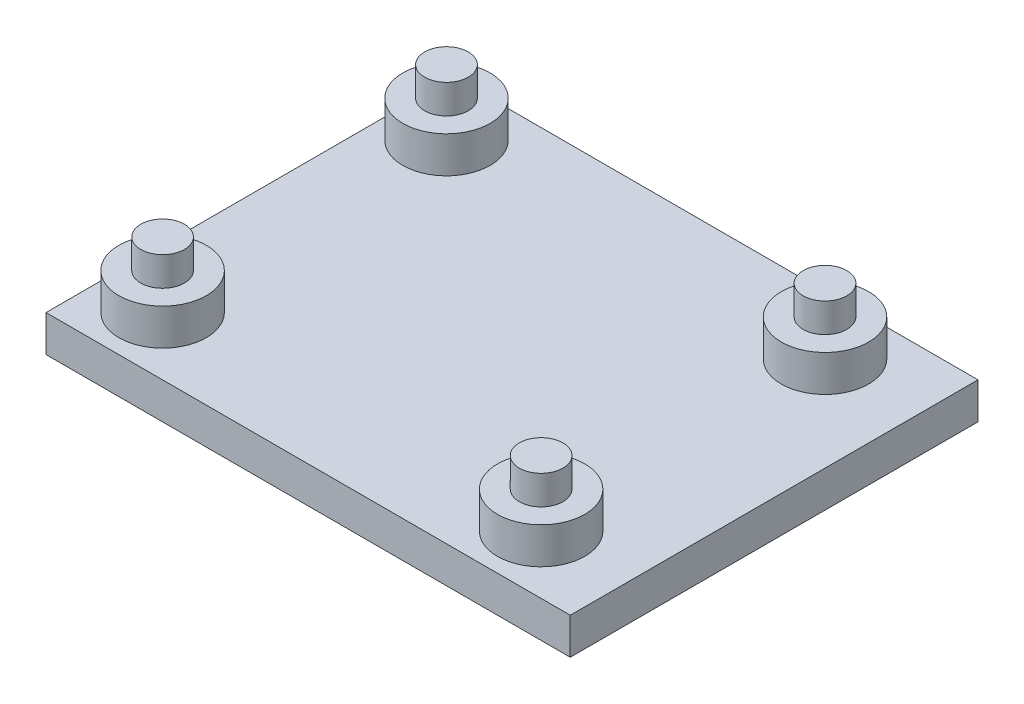
ISO-10303-21;
HEADER;
FILE_DESCRIPTION(('STEP AP214'),'2;1');
FILE_NAME('part.step','',(''),(''),'','','');
FILE_SCHEMA(('AUTOMOTIVE_DESIGN { 1 0 10303 214 1 1 1 1 }'));
ENDSEC;
DATA;
#1=APPLICATION_CONTEXT('core data for automotive mechanical design processes');
#2=APPLICATION_PROTOCOL_DEFINITION('international standard','automotive_design',2000,#1);
#3=PRODUCT_CONTEXT('',#1,'mechanical');
#4=PRODUCT('Part','Part','',(#3));
#5=PRODUCT_RELATED_PRODUCT_CATEGORY('part','',(#4));
#6=PRODUCT_DEFINITION_FORMATION('','',#4);
#7=PRODUCT_DEFINITION_CONTEXT('part definition',#1,'design');
#8=PRODUCT_DEFINITION('design','',#6,#7);
#9=PRODUCT_DEFINITION_SHAPE('','',#8);
#10=(LENGTH_UNIT() NAMED_UNIT(*) SI_UNIT(.MILLI.,.METRE.));
#11=(NAMED_UNIT(*) PLANE_ANGLE_UNIT() SI_UNIT($,.RADIAN.));
#12=(NAMED_UNIT(*) SI_UNIT($,.STERADIAN.) SOLID_ANGLE_UNIT());
#13=UNCERTAINTY_MEASURE_WITH_UNIT(LENGTH_MEASURE(1.E-05),#10,'distance_accuracy_value','');
#14=(GEOMETRIC_REPRESENTATION_CONTEXT(3) GLOBAL_UNCERTAINTY_ASSIGNED_CONTEXT((#13)) GLOBAL_UNIT_ASSIGNED_CONTEXT((#10,
#11,#12)) REPRESENTATION_CONTEXT('',''));
#15=CARTESIAN_POINT('',(0.,0.,0.));
#16=DIRECTION('',(0.,0.,1.));
#17=DIRECTION('',(1.,0.,0.));
#18=AXIS2_PLACEMENT_3D('',#15,#16,#17);
#19=CARTESIAN_POINT('',(0.,5.,0.));
#20=DIRECTION('',(0.,-1.,0.));
#21=DIRECTION('',(0.,0.,-1.));
#22=AXIS2_PLACEMENT_3D('',#19,#20,#21);
#23=PLANE('',#22);
#24=CARTESIAN_POINT('',(-14.5,5.,-10.));
#25=DIRECTION('',(0.,-1.,0.));
#26=DIRECTION('',(0.,0.,-1.));
#27=AXIS2_PLACEMENT_3D('',#24,#25,#26);
#28=CIRCLE('',#27,1.5);
#29=CARTESIAN_POINT('',(-14.5,5.,-11.5));
#30=VERTEX_POINT('',#29);
#31=EDGE_CURVE('E102',#30,#30,#28,.F.);
#32=ORIENTED_EDGE('',*,*,#31,.F.);
#33=EDGE_LOOP('',(#32));
#34=FACE_BOUND('',#33,.T.);
#35=CARTESIAN_POINT('',(-14.5,5.,-10.));
#36=DIRECTION('',(0.,1.,0.));
#37=DIRECTION('',(0.,0.,1.));
#38=AXIS2_PLACEMENT_3D('',#35,#36,#37);
#39=CIRCLE('',#38,3.);
#40=CARTESIAN_POINT('',(-14.5,5.,-7.));
#41=VERTEX_POINT('',#40);
#42=EDGE_CURVE('E127',#41,#41,#39,.T.);
#43=ORIENTED_EDGE('',*,*,#42,.T.);
#44=EDGE_LOOP('',(#43));
#45=FACE_BOUND('',#44,.T.);
#46=ADVANCED_FACE('F36',(#34,#45),#23,.F.);
#47=CARTESIAN_POINT('',(-14.5,7.,-10.));
#48=DIRECTION('',(0.,-1.,0.));
#49=DIRECTION('',(0.,0.,-1.));
#50=AXIS2_PLACEMENT_3D('',#47,#48,#49);
#51=CYLINDRICAL_SURFACE('',#50,1.5);
#52=CARTESIAN_POINT('',(-14.5,7.,-10.));
#53=DIRECTION('',(0.,1.,0.));
#54=DIRECTION('',(0.,0.,1.));
#55=AXIS2_PLACEMENT_3D('',#52,#53,#54);
#56=CIRCLE('',#55,1.5);
#57=CARTESIAN_POINT('',(-14.5,7.,-8.5));
#58=VERTEX_POINT('',#57);
#59=EDGE_CURVE('E145',#58,#58,#56,.T.);
#60=ORIENTED_EDGE('',*,*,#59,.F.);
#61=EDGE_LOOP('',(#60));
#62=FACE_BOUND('',#61,.T.);
#63=ORIENTED_EDGE('',*,*,#31,.T.);
#64=EDGE_LOOP('',(#63));
#65=FACE_BOUND('',#64,.T.);
#66=ADVANCED_FACE('F197',(#62,#65),#51,.T.);
#67=CARTESIAN_POINT('',(-14.5,7.,-10.));
#68=DIRECTION('',(0.,1.,0.));
#69=DIRECTION('',(0.,0.,1.));
#70=AXIS2_PLACEMENT_3D('',#67,#68,#69);
#71=PLANE('',#70);
#72=ORIENTED_EDGE('',*,*,#59,.T.);
#73=EDGE_LOOP('',(#72));
#74=FACE_BOUND('',#73,.T.);
#75=ADVANCED_FACE('F192',(#74),#71,.T.);
#76=CARTESIAN_POINT('',(-14.5,2.5,-10.));
#77=DIRECTION('',(0.,1.,0.));
#78=DIRECTION('',(0.,0.,1.));
#79=AXIS2_PLACEMENT_3D('',#76,#77,#78);
#80=CYLINDRICAL_SURFACE('',#79,3.);
#81=CARTESIAN_POINT('',(-14.5,2.5,-10.));
#82=DIRECTION('',(0.,1.,0.));
#83=DIRECTION('',(0.,0.,1.));
#84=AXIS2_PLACEMENT_3D('',#81,#82,#83);
#85=CIRCLE('',#84,3.);
#86=CARTESIAN_POINT('',(-14.5,2.5,-7.));
#87=VERTEX_POINT('',#86);
#88=EDGE_CURVE('E82',#87,#87,#85,.T.);
#89=ORIENTED_EDGE('',*,*,#88,.T.);
#90=EDGE_LOOP('',(#89));
#91=FACE_BOUND('',#90,.T.);
#92=ORIENTED_EDGE('',*,*,#42,.F.);
#93=EDGE_LOOP('',(#92));
#94=FACE_BOUND('',#93,.T.);
#95=ADVANCED_FACE('F188',(#91,#94),#80,.T.);
#96=CARTESIAN_POINT('',(-14.,2.5,9.9937490231322));
#97=DIRECTION('',(0.,1.,0.));
#98=DIRECTION('',(0.,0.,1.));
#99=AXIS2_PLACEMENT_3D('',#96,#97,#98);
#100=CYLINDRICAL_SURFACE('',#99,3.);
#101=CARTESIAN_POINT('',(-14.,2.5,9.9937490231322));
#102=DIRECTION('',(0.,1.,0.));
#103=DIRECTION('',(0.,0.,1.));
#104=AXIS2_PLACEMENT_3D('',#101,#102,#103);
#105=CIRCLE('',#104,3.);
#106=CARTESIAN_POINT('',(-14.,2.5,12.9937490231322));
#107=VERTEX_POINT('',#106);
#108=EDGE_CURVE('E166',#107,#107,#105,.T.);
#109=ORIENTED_EDGE('',*,*,#108,.T.);
#110=EDGE_LOOP('',(#109));
#111=FACE_BOUND('',#110,.T.);
#112=CARTESIAN_POINT('',(-14.,5.,9.9937490231322));
#113=DIRECTION('',(0.,1.,0.));
#114=DIRECTION('',(0.,0.,1.));
#115=AXIS2_PLACEMENT_3D('',#112,#113,#114);
#116=CIRCLE('',#115,3.);
#117=CARTESIAN_POINT('',(-14.,5.,12.9937490231322));
#118=VERTEX_POINT('',#117);
#119=EDGE_CURVE('E123',#118,#118,#116,.T.);
#120=ORIENTED_EDGE('',*,*,#119,.F.);
#121=EDGE_LOOP('',(#120));
#122=FACE_BOUND('',#121,.T.);
#123=ADVANCED_FACE('F191',(#111,#122),#100,.T.);
#124=CARTESIAN_POINT('',(12.,2.5,10.));
#125=DIRECTION('',(0.,1.,0.));
#126=DIRECTION('',(0.,0.,1.));
#127=AXIS2_PLACEMENT_3D('',#124,#125,#126);
#128=CYLINDRICAL_SURFACE('',#127,3.);
#129=CARTESIAN_POINT('',(12.,2.5,10.));
#130=DIRECTION('',(0.,1.,0.));
#131=DIRECTION('',(0.,0.,1.));
#132=AXIS2_PLACEMENT_3D('',#129,#130,#131);
#133=CIRCLE('',#132,3.);
#134=CARTESIAN_POINT('',(12.,2.5,13.));
#135=VERTEX_POINT('',#134);
#136=EDGE_CURVE('E169',#135,#135,#133,.T.);
#137=ORIENTED_EDGE('',*,*,#136,.T.);
#138=EDGE_LOOP('',(#137));
#139=FACE_BOUND('',#138,.T.);
#140=CARTESIAN_POINT('',(12.,5.,10.));
#141=DIRECTION('',(0.,1.,0.));
#142=DIRECTION('',(0.,0.,1.));
#143=AXIS2_PLACEMENT_3D('',#140,#141,#142);
#144=CIRCLE('',#143,3.);
#145=CARTESIAN_POINT('',(12.,5.,13.));
#146=VERTEX_POINT('',#145);
#147=EDGE_CURVE('E121',#146,#146,#144,.T.);
#148=ORIENTED_EDGE('',*,*,#147,.F.);
#149=EDGE_LOOP('',(#148));
#150=FACE_BOUND('',#149,.T.);
#151=ADVANCED_FACE('F222',(#139,#150),#128,.T.);
#152=CARTESIAN_POINT('',(11.4999992485587,2.5,-9.99374900434029));
#153=DIRECTION('',(0.,1.,0.));
#154=DIRECTION('',(0.,0.,1.));
#155=AXIS2_PLACEMENT_3D('',#152,#153,#154);
#156=CYLINDRICAL_SURFACE('',#155,3.);
#157=CARTESIAN_POINT('',(11.4999992485587,2.5,-9.99374900434029));
#158=DIRECTION('',(0.,1.,0.));
#159=DIRECTION('',(0.,0.,1.));
#160=AXIS2_PLACEMENT_3D('',#157,#158,#159);
#161=CIRCLE('',#160,3.);
#162=CARTESIAN_POINT('',(11.4999992485587,2.5,-6.99374900434029));
#163=VERTEX_POINT('',#162);
#164=EDGE_CURVE('E135',#163,#163,#161,.T.);
#165=ORIENTED_EDGE('',*,*,#164,.T.);
#166=EDGE_LOOP('',(#165));
#167=FACE_BOUND('',#166,.T.);
#168=CARTESIAN_POINT('',(11.4999992485587,5.,-9.99374900434029));
#169=DIRECTION('',(0.,1.,0.));
#170=DIRECTION('',(0.,0.,1.));
#171=AXIS2_PLACEMENT_3D('',#168,#169,#170);
#172=CIRCLE('',#171,3.);
#173=CARTESIAN_POINT('',(11.4999992485587,5.,-6.99374900434029));
#174=VERTEX_POINT('',#173);
#175=EDGE_CURVE('E124',#174,#174,#172,.T.);
#176=ORIENTED_EDGE('',*,*,#175,.F.);
#177=EDGE_LOOP('',(#176));
#178=FACE_BOUND('',#177,.T.);
#179=ADVANCED_FACE('F175',(#167,#178),#156,.T.);
#180=CARTESIAN_POINT('',(0.,2.5,0.));
#181=DIRECTION('',(0.,1.,0.));
#182=DIRECTION('',(0.,0.,1.));
#183=AXIS2_PLACEMENT_3D('',#180,#181,#182);
#184=PLANE('',#183);
#185=ORIENTED_EDGE('',*,*,#164,.F.);
#186=EDGE_LOOP('',(#185));
#187=FACE_BOUND('',#186,.T.);
#188=ORIENTED_EDGE('',*,*,#136,.F.);
#189=EDGE_LOOP('',(#188));
#190=FACE_BOUND('',#189,.T.);
#191=ORIENTED_EDGE('',*,*,#108,.F.);
#192=EDGE_LOOP('',(#191));
#193=FACE_BOUND('',#192,.T.);
#194=ORIENTED_EDGE('',*,*,#88,.F.);
#195=EDGE_LOOP('',(#194));
#196=FACE_BOUND('',#195,.T.);
#197=DIRECTION('',(1.,0.,0.));
#198=VECTOR('',#197,1.);
#199=CARTESIAN_POINT('',(0.,2.5,14.));
#200=LINE('',#199,#198);
#201=CARTESIAN_POINT('',(-18.,2.5,14.));
#202=VERTEX_POINT('',#201);
#203=CARTESIAN_POINT('',(18.,2.5,14.));
#204=VERTEX_POINT('',#203);
#205=EDGE_CURVE('E76',#202,#204,#200,.T.);
#206=ORIENTED_EDGE('',*,*,#205,.T.);
#207=DIRECTION('',(0.,0.,-1.));
#208=VECTOR('',#207,1.);
#209=CARTESIAN_POINT('',(18.,2.5,0.));
#210=LINE('',#209,#208);
#211=CARTESIAN_POINT('',(18.,2.5,-14.));
#212=VERTEX_POINT('',#211);
#213=EDGE_CURVE('E78',#204,#212,#210,.T.);
#214=ORIENTED_EDGE('',*,*,#213,.T.);
#215=DIRECTION('',(-1.,0.,0.));
#216=VECTOR('',#215,1.);
#217=CARTESIAN_POINT('',(0.,2.5,-14.));
#218=LINE('',#217,#216);
#219=CARTESIAN_POINT('',(-18.,2.5,-14.));
#220=VERTEX_POINT('',#219);
#221=EDGE_CURVE('E86',#212,#220,#218,.T.);
#222=ORIENTED_EDGE('',*,*,#221,.T.);
#223=DIRECTION('',(0.,0.,1.));
#224=VECTOR('',#223,1.);
#225=CARTESIAN_POINT('',(-18.,2.5,0.));
#226=LINE('',#225,#224);
#227=EDGE_CURVE('E51',#220,#202,#226,.T.);
#228=ORIENTED_EDGE('',*,*,#227,.T.);
#229=EDGE_LOOP('',(#206,#214,#222,#228));
#230=FACE_BOUND('',#229,.T.);
#231=ADVANCED_FACE('F77',(#187,#190,#193,#196,#230),#184,.T.);
#232=CARTESIAN_POINT('',(12.,7.,10.));
#233=DIRECTION('',(0.,1.,0.));
#234=DIRECTION('',(0.,0.,1.));
#235=AXIS2_PLACEMENT_3D('',#232,#233,#234);
#236=PLANE('',#235);
#237=CARTESIAN_POINT('',(12.,7.,10.));
#238=DIRECTION('',(0.,1.,0.));
#239=DIRECTION('',(0.,0.,1.));
#240=AXIS2_PLACEMENT_3D('',#237,#238,#239);
#241=CIRCLE('',#240,1.5);
#242=CARTESIAN_POINT('',(12.,7.,11.5));
#243=VERTEX_POINT('',#242);
#244=EDGE_CURVE('E139',#243,#243,#241,.T.);
#245=ORIENTED_EDGE('',*,*,#244,.T.);
#246=EDGE_LOOP('',(#245));
#247=FACE_BOUND('',#246,.T.);
#248=ADVANCED_FACE('F180',(#247),#236,.T.);
#249=CARTESIAN_POINT('',(12.,7.,10.));
#250=DIRECTION('',(0.,-1.,0.));
#251=DIRECTION('',(0.,0.,-1.));
#252=AXIS2_PLACEMENT_3D('',#249,#250,#251);
#253=CYLINDRICAL_SURFACE('',#252,1.5);
#254=ORIENTED_EDGE('',*,*,#244,.F.);
#255=EDGE_LOOP('',(#254));
#256=FACE_BOUND('',#255,.T.);
#257=CARTESIAN_POINT('',(12.,5.,10.));
#258=DIRECTION('',(0.,-1.,0.));
#259=DIRECTION('',(0.,0.,-1.));
#260=AXIS2_PLACEMENT_3D('',#257,#258,#259);
#261=CIRCLE('',#260,1.5);
#262=CARTESIAN_POINT('',(12.,5.,8.49999999999999));
#263=VERTEX_POINT('',#262);
#264=EDGE_CURVE('E44',#263,#263,#261,.F.);
#265=ORIENTED_EDGE('',*,*,#264,.T.);
#266=EDGE_LOOP('',(#265));
#267=FACE_BOUND('',#266,.T.);
#268=ADVANCED_FACE('F110',(#256,#267),#253,.T.);
#269=ORIENTED_EDGE('',*,*,#264,.F.);
#270=EDGE_LOOP('',(#269));
#271=FACE_BOUND('',#270,.T.);
#272=ORIENTED_EDGE('',*,*,#147,.T.);
#273=EDGE_LOOP('',(#272));
#274=FACE_BOUND('',#273,.T.);
#275=ADVANCED_FACE('F112',(#271,#274),#23,.F.);
#276=CARTESIAN_POINT('',(-14.,7.,9.9937490231322));
#277=DIRECTION('',(0.,1.,0.));
#278=DIRECTION('',(0.,0.,1.));
#279=AXIS2_PLACEMENT_3D('',#276,#277,#278);
#280=PLANE('',#279);
#281=CARTESIAN_POINT('',(-14.,7.,9.9937490231322));
#282=DIRECTION('',(0.,1.,0.));
#283=DIRECTION('',(0.,0.,1.));
#284=AXIS2_PLACEMENT_3D('',#281,#282,#283);
#285=CIRCLE('',#284,1.5);
#286=CARTESIAN_POINT('',(-14.,7.,11.4937490231322));
#287=VERTEX_POINT('',#286);
#288=EDGE_CURVE('E142',#287,#287,#285,.T.);
#289=ORIENTED_EDGE('',*,*,#288,.T.);
#290=EDGE_LOOP('',(#289));
#291=FACE_BOUND('',#290,.T.);
#292=ADVANCED_FACE('F115',(#291),#280,.T.);
#293=CARTESIAN_POINT('',(-14.,7.,9.9937490231322));
#294=DIRECTION('',(0.,-1.,0.));
#295=DIRECTION('',(0.,0.,-1.));
#296=AXIS2_PLACEMENT_3D('',#293,#294,#295);
#297=CYLINDRICAL_SURFACE('',#296,1.5);
#298=ORIENTED_EDGE('',*,*,#288,.F.);
#299=EDGE_LOOP('',(#298));
#300=FACE_BOUND('',#299,.T.);
#301=CARTESIAN_POINT('',(-14.,5.,9.9937490231322));
#302=DIRECTION('',(0.,-1.,0.));
#303=DIRECTION('',(0.,0.,-1.));
#304=AXIS2_PLACEMENT_3D('',#301,#302,#303);
#305=CIRCLE('',#304,1.5);
#306=CARTESIAN_POINT('',(-14.,5.,8.4937490231322));
#307=VERTEX_POINT('',#306);
#308=EDGE_CURVE('E105',#307,#307,#305,.F.);
#309=ORIENTED_EDGE('',*,*,#308,.T.);
#310=EDGE_LOOP('',(#309));
#311=FACE_BOUND('',#310,.T.);
#312=ADVANCED_FACE('F207',(#300,#311),#297,.T.);
#313=ORIENTED_EDGE('',*,*,#308,.F.);
#314=EDGE_LOOP('',(#313));
#315=FACE_BOUND('',#314,.T.);
#316=ORIENTED_EDGE('',*,*,#119,.T.);
#317=EDGE_LOOP('',(#316));
#318=FACE_BOUND('',#317,.T.);
#319=ADVANCED_FACE('F118',(#315,#318),#23,.F.);
#320=CARTESIAN_POINT('',(0.,0.,0.));
#321=DIRECTION('',(0.,-1.,0.));
#322=DIRECTION('',(0.,0.,-1.));
#323=AXIS2_PLACEMENT_3D('',#320,#321,#322);
#324=PLANE('',#323);
#325=DIRECTION('',(0.,0.,-1.));
#326=VECTOR('',#325,1.);
#327=CARTESIAN_POINT('',(18.,0.,14.));
#328=LINE('',#327,#326);
#329=CARTESIAN_POINT('',(18.,0.,14.));
#330=VERTEX_POINT('',#329);
#331=CARTESIAN_POINT('',(18.,0.,-14.));
#332=VERTEX_POINT('',#331);
#333=EDGE_CURVE('E148',#330,#332,#328,.T.);
#334=ORIENTED_EDGE('',*,*,#333,.F.);
#335=DIRECTION('',(1.,0.,0.));
#336=VECTOR('',#335,1.);
#337=CARTESIAN_POINT('',(-18.,0.,14.));
#338=LINE('',#337,#336);
#339=CARTESIAN_POINT('',(-18.,0.,14.));
#340=VERTEX_POINT('',#339);
#341=EDGE_CURVE('E90',#340,#330,#338,.T.);
#342=ORIENTED_EDGE('',*,*,#341,.F.);
#343=DIRECTION('',(0.,0.,1.));
#344=VECTOR('',#343,1.);
#345=CARTESIAN_POINT('',(-18.,0.,14.));
#346=LINE('',#345,#344);
#347=CARTESIAN_POINT('',(-18.,0.,-14.));
#348=VERTEX_POINT('',#347);
#349=EDGE_CURVE('E96',#348,#340,#346,.T.);
#350=ORIENTED_EDGE('',*,*,#349,.F.);
#351=DIRECTION('',(-1.,0.,0.));
#352=VECTOR('',#351,1.);
#353=CARTESIAN_POINT('',(-18.,0.,-14.));
#354=LINE('',#353,#352);
#355=EDGE_CURVE('E150',#332,#348,#354,.T.);
#356=ORIENTED_EDGE('',*,*,#355,.F.);
#357=EDGE_LOOP('',(#334,#342,#350,#356));
#358=FACE_BOUND('',#357,.T.);
#359=ADVANCED_FACE('F159',(#358),#324,.T.);
#360=CARTESIAN_POINT('',(-18.,5.,14.));
#361=DIRECTION('',(0.,0.,-1.));
#362=DIRECTION('',(-1.,0.,0.));
#363=AXIS2_PLACEMENT_3D('',#360,#361,#362);
#364=PLANE('',#363);
#365=ORIENTED_EDGE('',*,*,#205,.F.);
#366=DIRECTION('',(0.,-1.,0.));
#367=VECTOR('',#366,1.);
#368=CARTESIAN_POINT('',(-18.,5.,14.));
#369=LINE('',#368,#367);
#370=EDGE_CURVE('E92',#202,#340,#369,.T.);
#371=ORIENTED_EDGE('',*,*,#370,.T.);
#372=ORIENTED_EDGE('',*,*,#341,.T.);
#373=DIRECTION('',(0.,-1.,0.));
#374=VECTOR('',#373,1.);
#375=CARTESIAN_POINT('',(18.,5.,14.));
#376=LINE('',#375,#374);
#377=EDGE_CURVE('E59',#204,#330,#376,.T.);
#378=ORIENTED_EDGE('',*,*,#377,.F.);
#379=EDGE_LOOP('',(#365,#371,#372,#378));
#380=FACE_BOUND('',#379,.T.);
#381=ADVANCED_FACE('F88',(#380),#364,.F.);
#382=CARTESIAN_POINT('',(-18.,5.,14.));
#383=DIRECTION('',(1.,0.,0.));
#384=DIRECTION('',(0.,0.,-1.));
#385=AXIS2_PLACEMENT_3D('',#382,#383,#384);
#386=PLANE('',#385);
#387=ORIENTED_EDGE('',*,*,#227,.F.);
#388=DIRECTION('',(0.,-1.,0.));
#389=VECTOR('',#388,1.);
#390=CARTESIAN_POINT('',(-18.,5.,-14.));
#391=LINE('',#390,#389);
#392=EDGE_CURVE('E94',#220,#348,#391,.T.);
#393=ORIENTED_EDGE('',*,*,#392,.T.);
#394=ORIENTED_EDGE('',*,*,#349,.T.);
#395=ORIENTED_EDGE('',*,*,#370,.F.);
#396=EDGE_LOOP('',(#387,#393,#394,#395));
#397=FACE_BOUND('',#396,.T.);
#398=ADVANCED_FACE('F155',(#397),#386,.F.);
#399=CARTESIAN_POINT('',(-18.,5.,-14.));
#400=DIRECTION('',(0.,0.,1.));
#401=DIRECTION('',(1.,0.,0.));
#402=AXIS2_PLACEMENT_3D('',#399,#400,#401);
#403=PLANE('',#402);
#404=ORIENTED_EDGE('',*,*,#221,.F.);
#405=DIRECTION('',(0.,-1.,0.));
#406=VECTOR('',#405,1.);
#407=CARTESIAN_POINT('',(18.,5.,-14.));
#408=LINE('',#407,#406);
#409=EDGE_CURVE('E85',#212,#332,#408,.T.);
#410=ORIENTED_EDGE('',*,*,#409,.T.);
#411=ORIENTED_EDGE('',*,*,#355,.T.);
#412=ORIENTED_EDGE('',*,*,#392,.F.);
#413=EDGE_LOOP('',(#404,#410,#411,#412));
#414=FACE_BOUND('',#413,.T.);
#415=ADVANCED_FACE('F161',(#414),#403,.F.);
#416=CARTESIAN_POINT('',(18.,5.,14.));
#417=DIRECTION('',(-1.,0.,0.));
#418=DIRECTION('',(0.,0.,1.));
#419=AXIS2_PLACEMENT_3D('',#416,#417,#418);
#420=PLANE('',#419);
#421=ORIENTED_EDGE('',*,*,#213,.F.);
#422=ORIENTED_EDGE('',*,*,#377,.T.);
#423=ORIENTED_EDGE('',*,*,#333,.T.);
#424=ORIENTED_EDGE('',*,*,#409,.F.);
#425=EDGE_LOOP('',(#421,#422,#423,#424));
#426=FACE_BOUND('',#425,.T.);
#427=ADVANCED_FACE('F38',(#426),#420,.F.);
#428=CARTESIAN_POINT('',(11.4999992485587,7.,-9.99374900434029));
#429=DIRECTION('',(0.,1.,0.));
#430=DIRECTION('',(0.,0.,1.));
#431=AXIS2_PLACEMENT_3D('',#428,#429,#430);
#432=PLANE('',#431);
#433=CARTESIAN_POINT('',(11.4999992485587,7.,-9.99374900434029));
#434=DIRECTION('',(0.,1.,0.));
#435=DIRECTION('',(0.,0.,1.));
#436=AXIS2_PLACEMENT_3D('',#433,#434,#435);
#437=CIRCLE('',#436,1.5);
#438=CARTESIAN_POINT('',(11.4999992485587,7.,-8.49374900434029));
#439=VERTEX_POINT('',#438);
#440=EDGE_CURVE('E136',#439,#439,#437,.T.);
#441=ORIENTED_EDGE('',*,*,#440,.T.);
#442=EDGE_LOOP('',(#441));
#443=FACE_BOUND('',#442,.T.);
#444=ADVANCED_FACE('F215',(#443),#432,.T.);
#445=CARTESIAN_POINT('',(11.4999992485587,7.,-9.99374900434029));
#446=DIRECTION('',(0.,-1.,0.));
#447=DIRECTION('',(0.,0.,-1.));
#448=AXIS2_PLACEMENT_3D('',#445,#446,#447);
#449=CYLINDRICAL_SURFACE('',#448,1.5);
#450=ORIENTED_EDGE('',*,*,#440,.F.);
#451=EDGE_LOOP('',(#450));
#452=FACE_BOUND('',#451,.T.);
#453=CARTESIAN_POINT('',(11.4999992485587,5.,-9.99374900434029));
#454=DIRECTION('',(0.,-1.,0.));
#455=DIRECTION('',(0.,0.,-1.));
#456=AXIS2_PLACEMENT_3D('',#453,#454,#455);
#457=CIRCLE('',#456,1.5);
#458=CARTESIAN_POINT('',(11.4999992485587,5.,-11.4937490043403));
#459=VERTEX_POINT('',#458);
#460=EDGE_CURVE('E11',#459,#459,#457,.F.);
#461=ORIENTED_EDGE('',*,*,#460,.T.);
#462=EDGE_LOOP('',(#461));
#463=FACE_BOUND('',#462,.T.);
#464=ADVANCED_FACE('F210',(#452,#463),#449,.T.);
#465=ORIENTED_EDGE('',*,*,#460,.F.);
#466=EDGE_LOOP('',(#465));
#467=FACE_BOUND('',#466,.T.);
#468=ORIENTED_EDGE('',*,*,#175,.T.);
#469=EDGE_LOOP('',(#468));
#470=FACE_BOUND('',#469,.T.);
#471=ADVANCED_FACE('F117',(#467,#470),#23,.F.);
#472=CLOSED_SHELL('',(#46,#66,#75,#95,#123,#151,#179,#231,#248,#268,#275,#292,#312,#319,#359,
#381,#398,#415,#427,#444,#464,#471));
#473=MANIFOLD_SOLID_BREP('B2',#472);
#474=ADVANCED_BREP_SHAPE_REPRESENTATION('',(#18,#473),#14);
#475=SHAPE_DEFINITION_REPRESENTATION(#9,#474);
ENDSEC;
END-ISO-10303-21;
